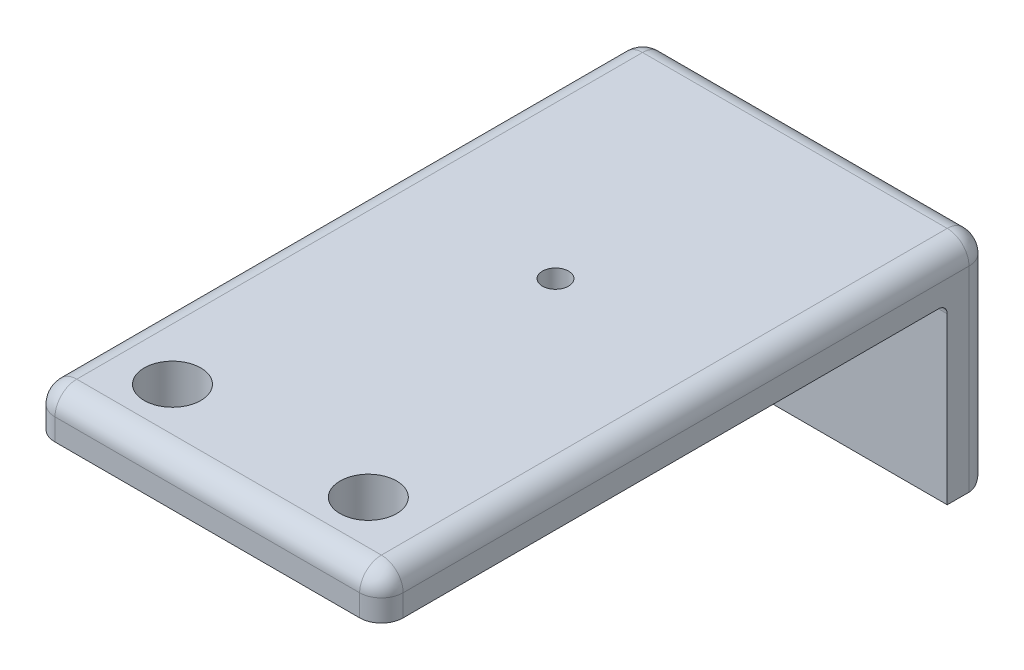
ISO-10303-21;
HEADER;
FILE_DESCRIPTION(('STEP AP214'),'2;1');
FILE_NAME('part.step','',(''),(''),'','','');
FILE_SCHEMA(('AUTOMOTIVE_DESIGN { 1 0 10303 214 1 1 1 1 }'));
ENDSEC;
DATA;
#1=APPLICATION_CONTEXT('core data for automotive mechanical design processes');
#2=APPLICATION_PROTOCOL_DEFINITION('international standard','automotive_design',2000,#1);
#3=PRODUCT_CONTEXT('',#1,'mechanical');
#4=PRODUCT('Part','Part','',(#3));
#5=PRODUCT_RELATED_PRODUCT_CATEGORY('part','',(#4));
#6=PRODUCT_DEFINITION_FORMATION('','',#4);
#7=PRODUCT_DEFINITION_CONTEXT('part definition',#1,'design');
#8=PRODUCT_DEFINITION('design','',#6,#7);
#9=PRODUCT_DEFINITION_SHAPE('','',#8);
#10=(LENGTH_UNIT() NAMED_UNIT(*) SI_UNIT(.MILLI.,.METRE.));
#11=(NAMED_UNIT(*) PLANE_ANGLE_UNIT() SI_UNIT($,.RADIAN.));
#12=(NAMED_UNIT(*) SI_UNIT($,.STERADIAN.) SOLID_ANGLE_UNIT());
#13=UNCERTAINTY_MEASURE_WITH_UNIT(LENGTH_MEASURE(1.E-05),#10,'distance_accuracy_value','');
#14=(GEOMETRIC_REPRESENTATION_CONTEXT(3) GLOBAL_UNCERTAINTY_ASSIGNED_CONTEXT((#13)) GLOBAL_UNIT_ASSIGNED_CONTEXT((#10,
#11,#12)) REPRESENTATION_CONTEXT('',''));
#15=CARTESIAN_POINT('',(0.,0.,0.));
#16=DIRECTION('',(0.,0.,1.));
#17=DIRECTION('',(1.,0.,0.));
#18=AXIS2_PLACEMENT_3D('',#15,#16,#17);
#19=CARTESIAN_POINT('',(80.,9.99999999999998,0.));
#20=DIRECTION('',(0.,0.,-1.));
#21=DIRECTION('',(0.,1.,0.));
#22=AXIS2_PLACEMENT_3D('',#19,#20,#21);
#23=PLANE('',#22);
#24=DIRECTION('',(-1.,0.,0.));
#25=VECTOR('',#24,1.);
#26=CARTESIAN_POINT('',(80.,0.,0.));
#27=LINE('',#26,#25);
#28=CARTESIAN_POINT('',(75.,0.,0.));
#29=VERTEX_POINT('',#28);
#30=CARTESIAN_POINT('',(5.,0.,0.));
#31=VERTEX_POINT('',#30);
#32=EDGE_CURVE('E146',#29,#31,#27,.T.);
#33=ORIENTED_EDGE('',*,*,#32,.F.);
#34=DIRECTION('',(0.,-1.,0.));
#35=VECTOR('',#34,1.);
#36=CARTESIAN_POINT('',(75.,9.99999999999998,0.));
#37=LINE('',#36,#35);
#38=CARTESIAN_POINT('',(75.,4.99999999999998,0.));
#39=VERTEX_POINT('',#38);
#40=EDGE_CURVE('E214',#29,#39,#37,.F.);
#41=ORIENTED_EDGE('',*,*,#40,.T.);
#42=DIRECTION('',(-1.,0.,0.));
#43=VECTOR('',#42,1.);
#44=CARTESIAN_POINT('',(80.,4.99999999999998,0.));
#45=LINE('',#44,#43);
#46=CARTESIAN_POINT('',(5.,4.99999999999998,0.));
#47=VERTEX_POINT('',#46);
#48=EDGE_CURVE('E212',#39,#47,#45,.T.);
#49=ORIENTED_EDGE('',*,*,#48,.T.);
#50=DIRECTION('',(0.,-1.,0.));
#51=VECTOR('',#50,1.);
#52=CARTESIAN_POINT('',(5.,9.99999999999998,0.));
#53=LINE('',#52,#51);
#54=EDGE_CURVE('E210',#47,#31,#53,.T.);
#55=ORIENTED_EDGE('',*,*,#54,.T.);
#56=EDGE_LOOP('',(#33,#41,#49,#55));
#57=FACE_BOUND('',#56,.T.);
#58=ADVANCED_FACE('F33',(#57),#23,.F.);
#59=CARTESIAN_POINT('',(80.,0.,0.));
#60=DIRECTION('',(0.,1.,0.));
#61=DIRECTION('',(0.,0.,1.));
#62=AXIS2_PLACEMENT_3D('',#59,#60,#61);
#63=PLANE('',#62);
#64=CARTESIAN_POINT('',(40.,0.,-80.));
#65=DIRECTION('',(0.,1.,0.));
#66=DIRECTION('',(0.,0.,1.));
#67=AXIS2_PLACEMENT_3D('',#64,#65,#66);
#68=CIRCLE('',#67,35.);
#69=CARTESIAN_POINT('',(40.,0.,-45.));
#70=VERTEX_POINT('',#69);
#71=EDGE_CURVE('E169',#70,#70,#68,.T.);
#72=ORIENTED_EDGE('',*,*,#71,.T.);
#73=EDGE_LOOP('',(#72));
#74=FACE_BOUND('',#73,.T.);
#75=CARTESIAN_POINT('',(62.,0.,-15.));
#76=DIRECTION('',(0.,-1.,0.));
#77=DIRECTION('',(0.,0.,-1.));
#78=AXIS2_PLACEMENT_3D('',#75,#76,#77);
#79=CIRCLE('',#78,6.49999999999999);
#80=CARTESIAN_POINT('',(62.,0.,-21.5));
#81=VERTEX_POINT('',#80);
#82=EDGE_CURVE('E320',#81,#81,#79,.T.);
#83=ORIENTED_EDGE('',*,*,#82,.F.);
#84=EDGE_LOOP('',(#83));
#85=FACE_BOUND('',#84,.T.);
#86=CARTESIAN_POINT('',(17.,0.,-15.));
#87=DIRECTION('',(0.,-1.,0.));
#88=DIRECTION('',(0.,0.,-1.));
#89=AXIS2_PLACEMENT_3D('',#86,#87,#88);
#90=CIRCLE('',#89,6.50000000000001);
#91=CARTESIAN_POINT('',(17.,0.,-21.5));
#92=VERTEX_POINT('',#91);
#93=EDGE_CURVE('E314',#92,#92,#90,.T.);
#94=ORIENTED_EDGE('',*,*,#93,.F.);
#95=EDGE_LOOP('',(#94));
#96=FACE_BOUND('',#95,.T.);
#97=DIRECTION('',(0.,0.,-1.));
#98=VECTOR('',#97,1.);
#99=CARTESIAN_POINT('',(0.,0.,0.));
#100=LINE('',#99,#98);
#101=CARTESIAN_POINT('',(0.,0.,-5.));
#102=VERTEX_POINT('',#101);
#103=CARTESIAN_POINT('',(0.,0.,-128.));
#104=VERTEX_POINT('',#103);
#105=EDGE_CURVE('E155',#102,#104,#100,.T.);
#106=ORIENTED_EDGE('',*,*,#105,.T.);
#107=DIRECTION('',(-1.,0.,0.));
#108=VECTOR('',#107,1.);
#109=CARTESIAN_POINT('',(80.,0.,-128.));
#110=LINE('',#109,#108);
#111=CARTESIAN_POINT('',(80.,0.,-128.));
#112=VERTEX_POINT('',#111);
#113=EDGE_CURVE('E54',#104,#112,#110,.F.);
#114=ORIENTED_EDGE('',*,*,#113,.T.);
#115=DIRECTION('',(0.,0.,-1.));
#116=VECTOR('',#115,1.);
#117=CARTESIAN_POINT('',(80.,0.,0.));
#118=LINE('',#117,#116);
#119=CARTESIAN_POINT('',(80.,0.,-5.));
#120=VERTEX_POINT('',#119);
#121=EDGE_CURVE('E137',#120,#112,#118,.T.);
#122=ORIENTED_EDGE('',*,*,#121,.F.);
#123=CARTESIAN_POINT('',(75.,0.,-5.));
#124=DIRECTION('',(0.,1.,0.));
#125=DIRECTION('',(0.,0.,1.));
#126=AXIS2_PLACEMENT_3D('',#123,#124,#125);
#127=CIRCLE('',#126,5.);
#128=EDGE_CURVE('E208',#120,#29,#127,.F.);
#129=ORIENTED_EDGE('',*,*,#128,.T.);
#130=ORIENTED_EDGE('',*,*,#32,.T.);
#131=CARTESIAN_POINT('',(5.,0.,-5.));
#132=DIRECTION('',(0.,1.,0.));
#133=DIRECTION('',(0.,0.,1.));
#134=AXIS2_PLACEMENT_3D('',#131,#132,#133);
#135=CIRCLE('',#134,5.);
#136=EDGE_CURVE('E206',#31,#102,#135,.F.);
#137=ORIENTED_EDGE('',*,*,#136,.T.);
#138=EDGE_LOOP('',(#106,#114,#122,#129,#130,#137));
#139=FACE_BOUND('',#138,.T.);
#140=ADVANCED_FACE('F311',(#74,#85,#96,#139),#63,.F.);
#141=CARTESIAN_POINT('',(80.,0.,-130.));
#142=DIRECTION('',(0.,0.,-1.));
#143=DIRECTION('',(-1.,0.,0.));
#144=AXIS2_PLACEMENT_3D('',#141,#142,#143);
#145=PLANE('',#144);
#146=CARTESIAN_POINT('',(40.,-28.,-130.));
#147=DIRECTION('',(0.,0.,1.));
#148=DIRECTION('',(1.,0.,0.));
#149=AXIS2_PLACEMENT_3D('',#146,#147,#148);
#150=CIRCLE('',#149,6.5);
#151=CARTESIAN_POINT('',(46.5,-28.,-130.));
#152=VERTEX_POINT('',#151);
#153=EDGE_CURVE('E257',#152,#152,#150,.T.);
#154=ORIENTED_EDGE('',*,*,#153,.F.);
#155=EDGE_LOOP('',(#154));
#156=FACE_BOUND('',#155,.T.);
#157=DIRECTION('',(0.,-1.,0.));
#158=VECTOR('',#157,1.);
#159=CARTESIAN_POINT('',(80.,0.,-130.));
#160=LINE('',#159,#158);
#161=CARTESIAN_POINT('',(80.,-2.,-130.));
#162=VERTEX_POINT('',#161);
#163=CARTESIAN_POINT('',(80.,-40.,-130.));
#164=VERTEX_POINT('',#163);
#165=EDGE_CURVE('E128',#162,#164,#160,.T.);
#166=ORIENTED_EDGE('',*,*,#165,.F.);
#167=DIRECTION('',(-1.,0.,0.));
#168=VECTOR('',#167,1.);
#169=CARTESIAN_POINT('',(0.,-2.,-130.));
#170=LINE('',#169,#168);
#171=CARTESIAN_POINT('',(0.,-2.,-130.));
#172=VERTEX_POINT('',#171);
#173=EDGE_CURVE('E216',#162,#172,#170,.T.);
#174=ORIENTED_EDGE('',*,*,#173,.T.);
#175=DIRECTION('',(0.,-1.,0.));
#176=VECTOR('',#175,1.);
#177=CARTESIAN_POINT('',(0.,0.,-130.));
#178=LINE('',#177,#176);
#179=CARTESIAN_POINT('',(0.,-40.,-130.));
#180=VERTEX_POINT('',#179);
#181=EDGE_CURVE('E142',#172,#180,#178,.T.);
#182=ORIENTED_EDGE('',*,*,#181,.T.);
#183=DIRECTION('',(-1.,0.,0.));
#184=VECTOR('',#183,1.);
#185=CARTESIAN_POINT('',(80.,-40.,-130.));
#186=LINE('',#185,#184);
#187=EDGE_CURVE('E140',#164,#180,#186,.T.);
#188=ORIENTED_EDGE('',*,*,#187,.F.);
#189=EDGE_LOOP('',(#166,#174,#182,#188));
#190=FACE_BOUND('',#189,.T.);
#191=ADVANCED_FACE('F141',(#156,#190),#145,.F.);
#192=CARTESIAN_POINT('',(80.,-40.,-130.));
#193=DIRECTION('',(0.,1.,0.));
#194=DIRECTION('',(0.,0.,1.));
#195=AXIS2_PLACEMENT_3D('',#192,#193,#194);
#196=PLANE('',#195);
#197=DIRECTION('',(0.,0.,-1.));
#198=VECTOR('',#197,1.);
#199=CARTESIAN_POINT('',(0.,-40.,-130.));
#200=LINE('',#199,#198);
#201=CARTESIAN_POINT('',(0.,-40.,-135.));
#202=VERTEX_POINT('',#201);
#203=EDGE_CURVE('E159',#180,#202,#200,.T.);
#204=ORIENTED_EDGE('',*,*,#203,.T.);
#205=DIRECTION('',(-1.,0.,0.));
#206=VECTOR('',#205,1.);
#207=CARTESIAN_POINT('',(80.,-40.,-135.));
#208=LINE('',#207,#206);
#209=CARTESIAN_POINT('',(80.,-40.,-135.));
#210=VERTEX_POINT('',#209);
#211=EDGE_CURVE('E151',#202,#210,#208,.F.);
#212=ORIENTED_EDGE('',*,*,#211,.T.);
#213=DIRECTION('',(0.,0.,-1.));
#214=VECTOR('',#213,1.);
#215=CARTESIAN_POINT('',(80.,-40.,-130.));
#216=LINE('',#215,#214);
#217=EDGE_CURVE('E132',#164,#210,#216,.T.);
#218=ORIENTED_EDGE('',*,*,#217,.F.);
#219=ORIENTED_EDGE('',*,*,#187,.T.);
#220=EDGE_LOOP('',(#204,#212,#218,#219));
#221=FACE_BOUND('',#220,.T.);
#222=ADVANCED_FACE('F149',(#221),#196,.F.);
#223=CARTESIAN_POINT('',(80.,-40.,-140.));
#224=DIRECTION('',(0.,0.,1.));
#225=DIRECTION('',(1.,0.,0.));
#226=AXIS2_PLACEMENT_3D('',#223,#224,#225);
#227=PLANE('',#226);
#228=DIRECTION('',(0.,1.,0.));
#229=VECTOR('',#228,1.);
#230=CARTESIAN_POINT('',(75.,-40.,-140.));
#231=LINE('',#230,#229);
#232=CARTESIAN_POINT('',(75.,5.,-140.));
#233=VERTEX_POINT('',#232);
#234=CARTESIAN_POINT('',(75.,-35.,-140.));
#235=VERTEX_POINT('',#234);
#236=EDGE_CURVE('E179',#233,#235,#231,.F.);
#237=ORIENTED_EDGE('',*,*,#236,.T.);
#238=DIRECTION('',(-1.,0.,0.));
#239=VECTOR('',#238,1.);
#240=CARTESIAN_POINT('',(80.,-35.,-140.));
#241=LINE('',#240,#239);
#242=CARTESIAN_POINT('',(5.,-35.,-140.));
#243=VERTEX_POINT('',#242);
#244=EDGE_CURVE('E181',#235,#243,#241,.T.);
#245=ORIENTED_EDGE('',*,*,#244,.T.);
#246=DIRECTION('',(0.,1.,0.));
#247=VECTOR('',#246,1.);
#248=CARTESIAN_POINT('',(5.,-40.,-140.));
#249=LINE('',#248,#247);
#250=CARTESIAN_POINT('',(5.,5.,-140.));
#251=VERTEX_POINT('',#250);
#252=EDGE_CURVE('E177',#243,#251,#249,.T.);
#253=ORIENTED_EDGE('',*,*,#252,.T.);
#254=DIRECTION('',(-1.,0.,0.));
#255=VECTOR('',#254,1.);
#256=CARTESIAN_POINT('',(80.,5.,-140.));
#257=LINE('',#256,#255);
#258=EDGE_CURVE('E175',#251,#233,#257,.F.);
#259=ORIENTED_EDGE('',*,*,#258,.T.);
#260=EDGE_LOOP('',(#237,#245,#253,#259));
#261=FACE_BOUND('',#260,.T.);
#262=CARTESIAN_POINT('',(40.,-28.,-140.));
#263=DIRECTION('',(0.,0.,1.));
#264=DIRECTION('',(1.,0.,0.));
#265=AXIS2_PLACEMENT_3D('',#262,#263,#264);
#266=CIRCLE('',#265,6.5);
#267=CARTESIAN_POINT('',(46.5,-28.,-140.));
#268=VERTEX_POINT('',#267);
#269=EDGE_CURVE('E323',#268,#268,#266,.T.);
#270=ORIENTED_EDGE('',*,*,#269,.T.);
#271=EDGE_LOOP('',(#270));
#272=FACE_BOUND('',#271,.T.);
#273=ADVANCED_FACE('F274',(#261,#272),#227,.F.);
#274=CARTESIAN_POINT('',(80.,10.,-140.));
#275=DIRECTION('',(0.,-1.,0.));
#276=DIRECTION('',(0.,0.,-1.));
#277=AXIS2_PLACEMENT_3D('',#274,#275,#276);
#278=PLANE('',#277);
#279=CARTESIAN_POINT('',(40.,10.,-80.));
#280=DIRECTION('',(0.,-1.,0.));
#281=DIRECTION('',(0.,0.,-1.));
#282=AXIS2_PLACEMENT_3D('',#279,#280,#281);
#283=CIRCLE('',#282,3.);
#284=CARTESIAN_POINT('',(40.,10.,-83.));
#285=VERTEX_POINT('',#284);
#286=EDGE_CURVE('E220',#285,#285,#283,.T.);
#287=ORIENTED_EDGE('',*,*,#286,.T.);
#288=EDGE_LOOP('',(#287));
#289=FACE_BOUND('',#288,.T.);
#290=DIRECTION('',(0.,0.,1.));
#291=VECTOR('',#290,1.);
#292=CARTESIAN_POINT('',(75.,10.,-140.));
#293=LINE('',#292,#291);
#294=CARTESIAN_POINT('',(75.,9.99999999999998,-5.));
#295=VERTEX_POINT('',#294);
#296=CARTESIAN_POINT('',(75.,10.,-135.));
#297=VERTEX_POINT('',#296);
#298=EDGE_CURVE('E201',#295,#297,#293,.F.);
#299=ORIENTED_EDGE('',*,*,#298,.T.);
#300=DIRECTION('',(-1.,0.,0.));
#301=VECTOR('',#300,1.);
#302=CARTESIAN_POINT('',(80.,10.,-135.));
#303=LINE('',#302,#301);
#304=CARTESIAN_POINT('',(5.,10.,-135.));
#305=VERTEX_POINT('',#304);
#306=EDGE_CURVE('E203',#297,#305,#303,.T.);
#307=ORIENTED_EDGE('',*,*,#306,.T.);
#308=DIRECTION('',(0.,0.,1.));
#309=VECTOR('',#308,1.);
#310=CARTESIAN_POINT('',(5.,10.,-140.));
#311=LINE('',#310,#309);
#312=CARTESIAN_POINT('',(5.,9.99999999999998,-5.));
#313=VERTEX_POINT('',#312);
#314=EDGE_CURVE('E197',#305,#313,#311,.T.);
#315=ORIENTED_EDGE('',*,*,#314,.T.);
#316=DIRECTION('',(-1.,0.,0.));
#317=VECTOR('',#316,1.);
#318=CARTESIAN_POINT('',(80.,9.99999999999998,-5.));
#319=LINE('',#318,#317);
#320=EDGE_CURVE('E199',#313,#295,#319,.F.);
#321=ORIENTED_EDGE('',*,*,#320,.T.);
#322=EDGE_LOOP('',(#299,#307,#315,#321));
#323=FACE_BOUND('',#322,.T.);
#324=CARTESIAN_POINT('',(62.,10.,-15.));
#325=DIRECTION('',(0.,-1.,0.));
#326=DIRECTION('',(0.,0.,-1.));
#327=AXIS2_PLACEMENT_3D('',#324,#325,#326);
#328=CIRCLE('',#327,6.49999999999999);
#329=CARTESIAN_POINT('',(62.,10.,-21.5));
#330=VERTEX_POINT('',#329);
#331=EDGE_CURVE('E317',#330,#330,#328,.T.);
#332=ORIENTED_EDGE('',*,*,#331,.T.);
#333=EDGE_LOOP('',(#332));
#334=FACE_BOUND('',#333,.T.);
#335=CARTESIAN_POINT('',(17.,10.,-15.));
#336=DIRECTION('',(0.,-1.,0.));
#337=DIRECTION('',(0.,0.,-1.));
#338=AXIS2_PLACEMENT_3D('',#335,#336,#337);
#339=CIRCLE('',#338,6.50000000000001);
#340=CARTESIAN_POINT('',(17.,10.,-21.5));
#341=VERTEX_POINT('',#340);
#342=EDGE_CURVE('E157',#341,#341,#339,.T.);
#343=ORIENTED_EDGE('',*,*,#342,.T.);
#344=EDGE_LOOP('',(#343));
#345=FACE_BOUND('',#344,.T.);
#346=ADVANCED_FACE('F296',(#289,#323,#334,#345),#278,.F.);
#347=CARTESIAN_POINT('',(80.,0.,0.));
#348=DIRECTION('',(1.,0.,0.));
#349=DIRECTION('',(0.,0.,-1.));
#350=AXIS2_PLACEMENT_3D('',#347,#348,#349);
#351=PLANE('',#350);
#352=ORIENTED_EDGE('',*,*,#217,.T.);
#353=DIRECTION('',(0.,1.,0.));
#354=VECTOR('',#353,1.);
#355=CARTESIAN_POINT('',(80.,10.,-135.));
#356=LINE('',#355,#354);
#357=CARTESIAN_POINT('',(80.,5.,-135.));
#358=VERTEX_POINT('',#357);
#359=EDGE_CURVE('E189',#210,#358,#356,.T.);
#360=ORIENTED_EDGE('',*,*,#359,.T.);
#361=DIRECTION('',(0.,0.,1.));
#362=VECTOR('',#361,1.);
#363=CARTESIAN_POINT('',(80.,4.99999999999998,0.));
#364=LINE('',#363,#362);
#365=CARTESIAN_POINT('',(80.,4.99999999999998,-5.));
#366=VERTEX_POINT('',#365);
#367=EDGE_CURVE('E185',#358,#366,#364,.T.);
#368=ORIENTED_EDGE('',*,*,#367,.T.);
#369=DIRECTION('',(0.,-1.,0.));
#370=VECTOR('',#369,1.);
#371=CARTESIAN_POINT('',(80.,0.,-5.));
#372=LINE('',#371,#370);
#373=EDGE_CURVE('E187',#366,#120,#372,.T.);
#374=ORIENTED_EDGE('',*,*,#373,.T.);
#375=ORIENTED_EDGE('',*,*,#121,.T.);
#376=CARTESIAN_POINT('',(80.,-2.,-128.));
#377=DIRECTION('',(1.,0.,0.));
#378=DIRECTION('',(0.,0.,-1.));
#379=AXIS2_PLACEMENT_3D('',#376,#377,#378);
#380=CIRCLE('',#379,2.);
#381=EDGE_CURVE('E11',#112,#162,#380,.F.);
#382=ORIENTED_EDGE('',*,*,#381,.T.);
#383=ORIENTED_EDGE('',*,*,#165,.T.);
#384=EDGE_LOOP('',(#352,#360,#368,#374,#375,#382,#383));
#385=FACE_BOUND('',#384,.T.);
#386=ADVANCED_FACE('F130',(#385),#351,.T.);
#387=CARTESIAN_POINT('',(0.,0.,0.));
#388=DIRECTION('',(1.,0.,0.));
#389=DIRECTION('',(0.,0.,-1.));
#390=AXIS2_PLACEMENT_3D('',#387,#388,#389);
#391=PLANE('',#390);
#392=DIRECTION('',(0.,0.,1.));
#393=VECTOR('',#392,1.);
#394=CARTESIAN_POINT('',(0.,4.99999999999998,0.));
#395=LINE('',#394,#393);
#396=CARTESIAN_POINT('',(0.,4.99999999999998,-5.));
#397=VERTEX_POINT('',#396);
#398=CARTESIAN_POINT('',(0.,5.,-135.));
#399=VERTEX_POINT('',#398);
#400=EDGE_CURVE('E191',#397,#399,#395,.F.);
#401=ORIENTED_EDGE('',*,*,#400,.T.);
#402=DIRECTION('',(0.,1.,0.));
#403=VECTOR('',#402,1.);
#404=CARTESIAN_POINT('',(0.,0.,-135.));
#405=LINE('',#404,#403);
#406=EDGE_CURVE('E195',#399,#202,#405,.F.);
#407=ORIENTED_EDGE('',*,*,#406,.T.);
#408=ORIENTED_EDGE('',*,*,#203,.F.);
#409=ORIENTED_EDGE('',*,*,#181,.F.);
#410=CARTESIAN_POINT('',(0.,-2.,-128.));
#411=DIRECTION('',(1.,0.,0.));
#412=DIRECTION('',(0.,0.,-1.));
#413=AXIS2_PLACEMENT_3D('',#410,#411,#412);
#414=CIRCLE('',#413,2.);
#415=EDGE_CURVE('E41',#172,#104,#414,.T.);
#416=ORIENTED_EDGE('',*,*,#415,.T.);
#417=ORIENTED_EDGE('',*,*,#105,.F.);
#418=DIRECTION('',(0.,-1.,0.));
#419=VECTOR('',#418,1.);
#420=CARTESIAN_POINT('',(0.,0.,-5.));
#421=LINE('',#420,#419);
#422=EDGE_CURVE('E193',#102,#397,#421,.F.);
#423=ORIENTED_EDGE('',*,*,#422,.T.);
#424=EDGE_LOOP('',(#401,#407,#408,#409,#416,#417,#423));
#425=FACE_BOUND('',#424,.T.);
#426=ADVANCED_FACE('F260',(#425),#391,.F.);
#427=CARTESIAN_POINT('',(17.,10.,-15.));
#428=DIRECTION('',(0.,-1.,0.));
#429=DIRECTION('',(0.,0.,-1.));
#430=AXIS2_PLACEMENT_3D('',#427,#428,#429);
#431=CYLINDRICAL_SURFACE('',#430,6.50000000000001);
#432=ORIENTED_EDGE('',*,*,#342,.F.);
#433=EDGE_LOOP('',(#432));
#434=FACE_BOUND('',#433,.T.);
#435=ORIENTED_EDGE('',*,*,#93,.T.);
#436=EDGE_LOOP('',(#435));
#437=FACE_BOUND('',#436,.T.);
#438=ADVANCED_FACE('F387',(#434,#437),#431,.F.);
#439=CARTESIAN_POINT('',(62.,10.,-15.));
#440=DIRECTION('',(0.,-1.,0.));
#441=DIRECTION('',(0.,0.,-1.));
#442=AXIS2_PLACEMENT_3D('',#439,#440,#441);
#443=CYLINDRICAL_SURFACE('',#442,6.49999999999999);
#444=ORIENTED_EDGE('',*,*,#331,.F.);
#445=EDGE_LOOP('',(#444));
#446=FACE_BOUND('',#445,.T.);
#447=ORIENTED_EDGE('',*,*,#82,.T.);
#448=EDGE_LOOP('',(#447));
#449=FACE_BOUND('',#448,.T.);
#450=ADVANCED_FACE('F392',(#446,#449),#443,.F.);
#451=CARTESIAN_POINT('',(40.,5.,-80.));
#452=DIRECTION('',(0.,-1.,0.));
#453=DIRECTION('',(0.,0.,-1.));
#454=AXIS2_PLACEMENT_3D('',#451,#452,#453);
#455=CYLINDRICAL_SURFACE('',#454,33.);
#456=CARTESIAN_POINT('',(40.,2.,-80.));
#457=DIRECTION('',(0.,1.,0.));
#458=DIRECTION('',(0.,0.,1.));
#459=AXIS2_PLACEMENT_3D('',#456,#457,#458);
#460=CIRCLE('',#459,33.);
#461=CARTESIAN_POINT('',(40.,2.,-47.));
#462=VERTEX_POINT('',#461);
#463=EDGE_CURVE('E166',#462,#462,#460,.F.);
#464=ORIENTED_EDGE('',*,*,#463,.T.);
#465=EDGE_LOOP('',(#464));
#466=FACE_BOUND('',#465,.T.);
#467=CARTESIAN_POINT('',(40.,3.,-80.));
#468=DIRECTION('',(0.,-1.,0.));
#469=DIRECTION('',(0.,0.,-1.));
#470=AXIS2_PLACEMENT_3D('',#467,#468,#469);
#471=CIRCLE('',#470,33.);
#472=CARTESIAN_POINT('',(40.,3.,-113.));
#473=VERTEX_POINT('',#472);
#474=EDGE_CURVE('E163',#473,#473,#471,.F.);
#475=ORIENTED_EDGE('',*,*,#474,.T.);
#476=EDGE_LOOP('',(#475));
#477=FACE_BOUND('',#476,.T.);
#478=ADVANCED_FACE('F347',(#466,#477),#455,.F.);
#479=CARTESIAN_POINT('',(40.,5.,-80.));
#480=DIRECTION('',(0.,-1.,0.));
#481=DIRECTION('',(0.,0.,-1.));
#482=AXIS2_PLACEMENT_3D('',#479,#480,#481);
#483=PLANE('',#482);
#484=CARTESIAN_POINT('',(40.,5.,-80.));
#485=DIRECTION('',(0.,-1.,0.));
#486=DIRECTION('',(0.,0.,-1.));
#487=AXIS2_PLACEMENT_3D('',#484,#485,#486);
#488=CIRCLE('',#487,3.);
#489=CARTESIAN_POINT('',(40.,5.,-83.));
#490=VERTEX_POINT('',#489);
#491=EDGE_CURVE('E330',#490,#490,#488,.T.);
#492=ORIENTED_EDGE('',*,*,#491,.F.);
#493=EDGE_LOOP('',(#492));
#494=FACE_BOUND('',#493,.T.);
#495=CARTESIAN_POINT('',(40.,5.,-80.));
#496=DIRECTION('',(0.,-1.,0.));
#497=DIRECTION('',(0.,0.,-1.));
#498=AXIS2_PLACEMENT_3D('',#495,#496,#497);
#499=CIRCLE('',#498,31.);
#500=CARTESIAN_POINT('',(40.,5.,-111.));
#501=VERTEX_POINT('',#500);
#502=EDGE_CURVE('E172',#501,#501,#499,.T.);
#503=ORIENTED_EDGE('',*,*,#502,.T.);
#504=EDGE_LOOP('',(#503));
#505=FACE_BOUND('',#504,.T.);
#506=ADVANCED_FACE('F343',(#494,#505),#483,.T.);
#507=CARTESIAN_POINT('',(40.,2.,-80.));
#508=DIRECTION('',(0.,1.,0.));
#509=DIRECTION('',(0.,0.,1.));
#510=AXIS2_PLACEMENT_3D('',#507,#508,#509);
#511=TOROIDAL_SURFACE('',#510,35.,2.);
#512=ORIENTED_EDGE('',*,*,#71,.F.);
#513=EDGE_LOOP('',(#512));
#514=FACE_BOUND('',#513,.T.);
#515=ORIENTED_EDGE('',*,*,#463,.F.);
#516=EDGE_LOOP('',(#515));
#517=FACE_BOUND('',#516,.T.);
#518=ADVANCED_FACE('F346',(#514,#517),#511,.T.);
#519=CARTESIAN_POINT('',(40.,3.,-80.));
#520=DIRECTION('',(0.,-1.,0.));
#521=DIRECTION('',(0.,0.,-1.));
#522=AXIS2_PLACEMENT_3D('',#519,#520,#521);
#523=TOROIDAL_SURFACE('',#522,31.,2.);
#524=ORIENTED_EDGE('',*,*,#474,.F.);
#525=EDGE_LOOP('',(#524));
#526=FACE_BOUND('',#525,.T.);
#527=ORIENTED_EDGE('',*,*,#502,.F.);
#528=EDGE_LOOP('',(#527));
#529=FACE_BOUND('',#528,.T.);
#530=ADVANCED_FACE('F351',(#526,#529),#523,.F.);
#531=CARTESIAN_POINT('',(40.,-28.,-140.));
#532=DIRECTION('',(0.,0.,1.));
#533=DIRECTION('',(1.,0.,0.));
#534=AXIS2_PLACEMENT_3D('',#531,#532,#533);
#535=CYLINDRICAL_SURFACE('',#534,6.5);
#536=ORIENTED_EDGE('',*,*,#269,.F.);
#537=EDGE_LOOP('',(#536));
#538=FACE_BOUND('',#537,.T.);
#539=ORIENTED_EDGE('',*,*,#153,.T.);
#540=EDGE_LOOP('',(#539));
#541=FACE_BOUND('',#540,.T.);
#542=ADVANCED_FACE('F353',(#538,#541),#535,.F.);
#543=CARTESIAN_POINT('',(75.,0.,-5.));
#544=DIRECTION('',(0.,1.,0.));
#545=DIRECTION('',(0.,0.,1.));
#546=AXIS2_PLACEMENT_3D('',#543,#544,#545);
#547=CYLINDRICAL_SURFACE('',#546,5.);
#548=ORIENTED_EDGE('',*,*,#128,.F.);
#549=ORIENTED_EDGE('',*,*,#373,.F.);
#550=CARTESIAN_POINT('',(75.,4.99999999999998,-5.));
#551=DIRECTION('',(0.,1.,0.));
#552=DIRECTION('',(0.,0.,1.));
#553=AXIS2_PLACEMENT_3D('',#550,#551,#552);
#554=CIRCLE('',#553,5.);
#555=EDGE_CURVE('E254',#39,#366,#554,.T.);
#556=ORIENTED_EDGE('',*,*,#555,.F.);
#557=ORIENTED_EDGE('',*,*,#40,.F.);
#558=EDGE_LOOP('',(#548,#549,#556,#557));
#559=FACE_BOUND('',#558,.T.);
#560=ADVANCED_FACE('F310',(#559),#547,.T.);
#561=CARTESIAN_POINT('',(80.,4.99999999999998,-5.));
#562=DIRECTION('',(-1.,0.,0.));
#563=DIRECTION('',(0.,0.,1.));
#564=AXIS2_PLACEMENT_3D('',#561,#562,#563);
#565=CYLINDRICAL_SURFACE('',#564,5.);
#566=CARTESIAN_POINT('',(5.,4.99999999999998,-5.));
#567=DIRECTION('',(-1.,0.,0.));
#568=DIRECTION('',(0.,0.,1.));
#569=AXIS2_PLACEMENT_3D('',#566,#567,#568);
#570=CIRCLE('',#569,5.);
#571=EDGE_CURVE('E248',#47,#313,#570,.T.);
#572=ORIENTED_EDGE('',*,*,#571,.F.);
#573=ORIENTED_EDGE('',*,*,#48,.F.);
#574=CARTESIAN_POINT('',(75.,4.99999999999998,-5.));
#575=DIRECTION('',(1.,0.,0.));
#576=DIRECTION('',(0.,0.,-1.));
#577=AXIS2_PLACEMENT_3D('',#574,#575,#576);
#578=CIRCLE('',#577,5.);
#579=EDGE_CURVE('E251',#295,#39,#578,.T.);
#580=ORIENTED_EDGE('',*,*,#579,.F.);
#581=ORIENTED_EDGE('',*,*,#320,.F.);
#582=EDGE_LOOP('',(#572,#573,#580,#581));
#583=FACE_BOUND('',#582,.T.);
#584=ADVANCED_FACE('F303',(#583),#565,.T.);
#585=CARTESIAN_POINT('',(5.,9.99999999999998,-5.));
#586=DIRECTION('',(0.,-1.,0.));
#587=DIRECTION('',(0.,0.,-1.));
#588=AXIS2_PLACEMENT_3D('',#585,#586,#587);
#589=CYLINDRICAL_SURFACE('',#588,5.);
#590=ORIENTED_EDGE('',*,*,#136,.F.);
#591=ORIENTED_EDGE('',*,*,#54,.F.);
#592=CARTESIAN_POINT('',(5.,4.99999999999998,-5.));
#593=DIRECTION('',(0.,1.,0.));
#594=DIRECTION('',(0.,0.,1.));
#595=AXIS2_PLACEMENT_3D('',#592,#593,#594);
#596=CIRCLE('',#595,5.);
#597=EDGE_CURVE('E245',#397,#47,#596,.T.);
#598=ORIENTED_EDGE('',*,*,#597,.F.);
#599=ORIENTED_EDGE('',*,*,#422,.F.);
#600=EDGE_LOOP('',(#590,#591,#598,#599));
#601=FACE_BOUND('',#600,.T.);
#602=ADVANCED_FACE('F439',(#601),#589,.T.);
#603=CARTESIAN_POINT('',(75.,4.99999999999998,-5.));
#604=DIRECTION('',(0.,0.,1.));
#605=DIRECTION('',(1.,0.,0.));
#606=AXIS2_PLACEMENT_3D('',#603,#604,#605);
#607=SPHERICAL_SURFACE('',#606,5.);
#608=ORIENTED_EDGE('',*,*,#579,.T.);
#609=ORIENTED_EDGE('',*,*,#555,.T.);
#610=CARTESIAN_POINT('',(75.,4.99999999999998,-5.));
#611=DIRECTION('',(0.,0.,1.));
#612=DIRECTION('',(1.,0.,0.));
#613=AXIS2_PLACEMENT_3D('',#610,#611,#612);
#614=CIRCLE('',#613,5.);
#615=EDGE_CURVE('E242',#295,#366,#614,.F.);
#616=ORIENTED_EDGE('',*,*,#615,.F.);
#617=EDGE_LOOP('',(#608,#609,#616));
#618=FACE_BOUND('',#617,.T.);
#619=ADVANCED_FACE('F306',(#618),#607,.T.);
#620=CARTESIAN_POINT('',(5.,4.99999999999998,-5.));
#621=DIRECTION('',(0.,0.,1.));
#622=DIRECTION('',(1.,0.,0.));
#623=AXIS2_PLACEMENT_3D('',#620,#621,#622);
#624=SPHERICAL_SURFACE('',#623,5.);
#625=ORIENTED_EDGE('',*,*,#597,.T.);
#626=ORIENTED_EDGE('',*,*,#571,.T.);
#627=CARTESIAN_POINT('',(5.,4.99999999999998,-5.));
#628=DIRECTION('',(0.,0.,1.));
#629=DIRECTION('',(0.,-1.,0.));
#630=AXIS2_PLACEMENT_3D('',#627,#628,#629);
#631=CIRCLE('',#630,5.);
#632=EDGE_CURVE('E239',#397,#313,#631,.F.);
#633=ORIENTED_EDGE('',*,*,#632,.F.);
#634=EDGE_LOOP('',(#625,#626,#633));
#635=FACE_BOUND('',#634,.T.);
#636=ADVANCED_FACE('F453',(#635),#624,.T.);
#637=CARTESIAN_POINT('',(75.,4.99999999999998,0.));
#638=DIRECTION('',(0.,0.,-1.));
#639=DIRECTION('',(0.,1.,0.));
#640=AXIS2_PLACEMENT_3D('',#637,#638,#639);
#641=CYLINDRICAL_SURFACE('',#640,5.);
#642=ORIENTED_EDGE('',*,*,#615,.T.);
#643=ORIENTED_EDGE('',*,*,#367,.F.);
#644=CARTESIAN_POINT('',(75.,5.,-135.));
#645=DIRECTION('',(0.,0.,-1.));
#646=DIRECTION('',(-1.,0.,0.));
#647=AXIS2_PLACEMENT_3D('',#644,#645,#646);
#648=CIRCLE('',#647,5.);
#649=EDGE_CURVE('E236',#297,#358,#648,.T.);
#650=ORIENTED_EDGE('',*,*,#649,.F.);
#651=ORIENTED_EDGE('',*,*,#298,.F.);
#652=EDGE_LOOP('',(#642,#643,#650,#651));
#653=FACE_BOUND('',#652,.T.);
#654=ADVANCED_FACE('F285',(#653),#641,.T.);
#655=CARTESIAN_POINT('',(80.,5.,-135.));
#656=DIRECTION('',(-1.,0.,0.));
#657=DIRECTION('',(0.,0.,1.));
#658=AXIS2_PLACEMENT_3D('',#655,#656,#657);
#659=CYLINDRICAL_SURFACE('',#658,5.);
#660=CARTESIAN_POINT('',(5.,5.,-135.));
#661=DIRECTION('',(-1.,0.,0.));
#662=DIRECTION('',(0.,0.,1.));
#663=AXIS2_PLACEMENT_3D('',#660,#661,#662);
#664=CIRCLE('',#663,5.);
#665=EDGE_CURVE('E230',#305,#251,#664,.T.);
#666=ORIENTED_EDGE('',*,*,#665,.F.);
#667=ORIENTED_EDGE('',*,*,#306,.F.);
#668=CARTESIAN_POINT('',(75.,5.,-135.));
#669=DIRECTION('',(1.,0.,0.));
#670=DIRECTION('',(0.,0.,-1.));
#671=AXIS2_PLACEMENT_3D('',#668,#669,#670);
#672=CIRCLE('',#671,5.);
#673=EDGE_CURVE('E233',#233,#297,#672,.T.);
#674=ORIENTED_EDGE('',*,*,#673,.F.);
#675=ORIENTED_EDGE('',*,*,#258,.F.);
#676=EDGE_LOOP('',(#666,#667,#674,#675));
#677=FACE_BOUND('',#676,.T.);
#678=ADVANCED_FACE('F293',(#677),#659,.T.);
#679=CARTESIAN_POINT('',(5.,5.,-140.));
#680=DIRECTION('',(0.,0.,1.));
#681=DIRECTION('',(0.,-1.,0.));
#682=AXIS2_PLACEMENT_3D('',#679,#680,#681);
#683=CYLINDRICAL_SURFACE('',#682,5.);
#684=ORIENTED_EDGE('',*,*,#632,.T.);
#685=ORIENTED_EDGE('',*,*,#314,.F.);
#686=CARTESIAN_POINT('',(5.,5.,-135.));
#687=DIRECTION('',(0.,0.,-1.));
#688=DIRECTION('',(-1.,0.,0.));
#689=AXIS2_PLACEMENT_3D('',#686,#687,#688);
#690=CIRCLE('',#689,5.);
#691=EDGE_CURVE('E228',#399,#305,#690,.T.);
#692=ORIENTED_EDGE('',*,*,#691,.F.);
#693=ORIENTED_EDGE('',*,*,#400,.F.);
#694=EDGE_LOOP('',(#684,#685,#692,#693));
#695=FACE_BOUND('',#694,.T.);
#696=ADVANCED_FACE('F473',(#695),#683,.T.);
#697=CARTESIAN_POINT('',(75.,5.,-135.));
#698=DIRECTION('',(0.,0.,1.));
#699=DIRECTION('',(1.,0.,0.));
#700=AXIS2_PLACEMENT_3D('',#697,#698,#699);
#701=SPHERICAL_SURFACE('',#700,5.);
#702=ORIENTED_EDGE('',*,*,#673,.T.);
#703=ORIENTED_EDGE('',*,*,#649,.T.);
#704=CARTESIAN_POINT('',(75.,5.,-135.));
#705=DIRECTION('',(0.,1.,0.));
#706=DIRECTION('',(0.,0.,1.));
#707=AXIS2_PLACEMENT_3D('',#704,#705,#706);
#708=CIRCLE('',#707,5.);
#709=EDGE_CURVE('E225',#233,#358,#708,.F.);
#710=ORIENTED_EDGE('',*,*,#709,.F.);
#711=EDGE_LOOP('',(#702,#703,#710));
#712=FACE_BOUND('',#711,.T.);
#713=ADVANCED_FACE('F289',(#712),#701,.T.);
#714=CARTESIAN_POINT('',(5.,5.,-135.));
#715=DIRECTION('',(0.,0.,1.));
#716=DIRECTION('',(1.,0.,0.));
#717=AXIS2_PLACEMENT_3D('',#714,#715,#716);
#718=SPHERICAL_SURFACE('',#717,5.);
#719=ORIENTED_EDGE('',*,*,#691,.T.);
#720=ORIENTED_EDGE('',*,*,#665,.T.);
#721=CARTESIAN_POINT('',(5.,5.,-135.));
#722=DIRECTION('',(0.,1.,0.));
#723=DIRECTION('',(0.,0.,1.));
#724=AXIS2_PLACEMENT_3D('',#721,#722,#723);
#725=CIRCLE('',#724,5.);
#726=EDGE_CURVE('E222',#399,#251,#725,.F.);
#727=ORIENTED_EDGE('',*,*,#726,.F.);
#728=EDGE_LOOP('',(#719,#720,#727));
#729=FACE_BOUND('',#728,.T.);
#730=ADVANCED_FACE('F487',(#729),#718,.T.);
#731=CARTESIAN_POINT('',(75.,0.,-135.));
#732=DIRECTION('',(0.,-1.,0.));
#733=DIRECTION('',(0.,0.,-1.));
#734=AXIS2_PLACEMENT_3D('',#731,#732,#733);
#735=CYLINDRICAL_SURFACE('',#734,5.);
#736=ORIENTED_EDGE('',*,*,#709,.T.);
#737=ORIENTED_EDGE('',*,*,#359,.F.);
#738=CARTESIAN_POINT('',(75.,-35.,-135.));
#739=DIRECTION('',(-0.707106781186547,-0.707106781186547,0.));
#740=DIRECTION('',(0.707106781186547,-0.707106781186547,0.));
#741=AXIS2_PLACEMENT_3D('',#738,#739,#740);
#742=ELLIPSE('',#741,7.07106781186547,5.);
#743=EDGE_CURVE('E219',#235,#210,#742,.T.);
#744=ORIENTED_EDGE('',*,*,#743,.F.);
#745=ORIENTED_EDGE('',*,*,#236,.F.);
#746=EDGE_LOOP('',(#736,#737,#744,#745));
#747=FACE_BOUND('',#746,.T.);
#748=ADVANCED_FACE('F279',(#747),#735,.T.);
#749=CARTESIAN_POINT('',(5.,-40.,-135.));
#750=DIRECTION('',(0.,1.,0.));
#751=DIRECTION('',(0.,0.,1.));
#752=AXIS2_PLACEMENT_3D('',#749,#750,#751);
#753=CYLINDRICAL_SURFACE('',#752,5.);
#754=ORIENTED_EDGE('',*,*,#726,.T.);
#755=ORIENTED_EDGE('',*,*,#252,.F.);
#756=CARTESIAN_POINT('',(5.,-35.,-135.));
#757=DIRECTION('',(-0.707106781186547,0.707106781186547,0.));
#758=DIRECTION('',(0.707106781186547,0.707106781186547,0.));
#759=AXIS2_PLACEMENT_3D('',#756,#757,#758);
#760=ELLIPSE('',#759,7.07106781186547,5.);
#761=EDGE_CURVE('E217',#202,#243,#760,.F.);
#762=ORIENTED_EDGE('',*,*,#761,.F.);
#763=ORIENTED_EDGE('',*,*,#406,.F.);
#764=EDGE_LOOP('',(#754,#755,#762,#763));
#765=FACE_BOUND('',#764,.T.);
#766=ADVANCED_FACE('F270',(#765),#753,.T.);
#767=CARTESIAN_POINT('',(80.,-35.,-135.));
#768=DIRECTION('',(-1.,0.,0.));
#769=DIRECTION('',(0.,0.,1.));
#770=AXIS2_PLACEMENT_3D('',#767,#768,#769);
#771=CYLINDRICAL_SURFACE('',#770,5.);
#772=ORIENTED_EDGE('',*,*,#743,.T.);
#773=ORIENTED_EDGE('',*,*,#211,.F.);
#774=ORIENTED_EDGE('',*,*,#761,.T.);
#775=ORIENTED_EDGE('',*,*,#244,.F.);
#776=EDGE_LOOP('',(#772,#773,#774,#775));
#777=FACE_BOUND('',#776,.T.);
#778=ADVANCED_FACE('F264',(#777),#771,.T.);
#779=CARTESIAN_POINT('',(80.,-2.,-128.));
#780=DIRECTION('',(1.,0.,0.));
#781=DIRECTION('',(0.,0.,-1.));
#782=AXIS2_PLACEMENT_3D('',#779,#780,#781);
#783=CYLINDRICAL_SURFACE('',#782,2.);
#784=ORIENTED_EDGE('',*,*,#381,.F.);
#785=ORIENTED_EDGE('',*,*,#113,.F.);
#786=ORIENTED_EDGE('',*,*,#415,.F.);
#787=ORIENTED_EDGE('',*,*,#173,.F.);
#788=EDGE_LOOP('',(#784,#785,#786,#787));
#789=FACE_BOUND('',#788,.T.);
#790=ADVANCED_FACE('F35',(#789),#783,.F.);
#791=CARTESIAN_POINT('',(40.,10.,-80.));
#792=DIRECTION('',(0.,-1.,0.));
#793=DIRECTION('',(0.,0.,-1.));
#794=AXIS2_PLACEMENT_3D('',#791,#792,#793);
#795=CYLINDRICAL_SURFACE('',#794,3.);
#796=ORIENTED_EDGE('',*,*,#286,.F.);
#797=EDGE_LOOP('',(#796));
#798=FACE_BOUND('',#797,.T.);
#799=ORIENTED_EDGE('',*,*,#491,.T.);
#800=EDGE_LOOP('',(#799));
#801=FACE_BOUND('',#800,.T.);
#802=ADVANCED_FACE('F337',(#798,#801),#795,.F.);
#803=CLOSED_SHELL('',(#58,#140,#191,#222,#273,#346,#386,#426,#438,#450,#478,#506,#518,#530,#542,
#560,#584,#602,#619,#636,#654,#678,#696,#713,#730,#748,#766,#778,#790,#802));
#804=MANIFOLD_SOLID_BREP('B2',#803);
#805=ADVANCED_BREP_SHAPE_REPRESENTATION('',(#18,#804),#14);
#806=SHAPE_DEFINITION_REPRESENTATION(#9,#805);
ENDSEC;
END-ISO-10303-21;
